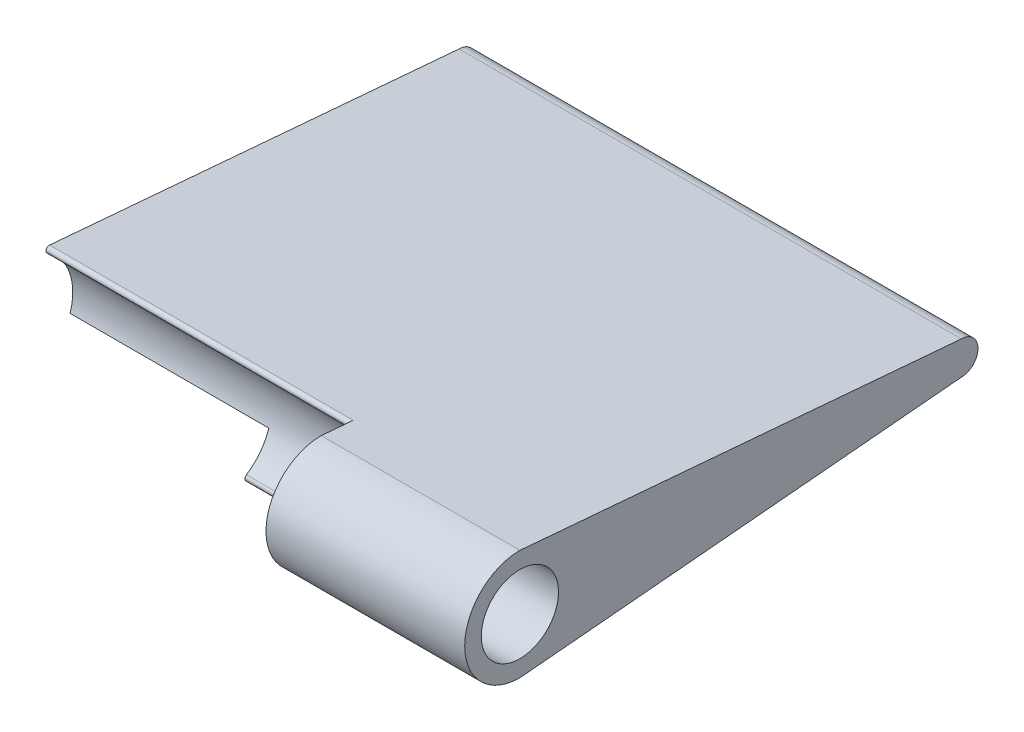
ISO-10303-21;
HEADER;
FILE_DESCRIPTION(('STEP AP214'),'2;1');
FILE_NAME('part.step','',(''),(''),'','','');
FILE_SCHEMA(('AUTOMOTIVE_DESIGN { 1 0 10303 214 1 1 1 1 }'));
ENDSEC;
DATA;
#1=APPLICATION_CONTEXT('core data for automotive mechanical design processes');
#2=APPLICATION_PROTOCOL_DEFINITION('international standard','automotive_design',2000,#1);
#3=PRODUCT_CONTEXT('',#1,'mechanical');
#4=PRODUCT('Part','Part','',(#3));
#5=PRODUCT_RELATED_PRODUCT_CATEGORY('part','',(#4));
#6=PRODUCT_DEFINITION_FORMATION('','',#4);
#7=PRODUCT_DEFINITION_CONTEXT('part definition',#1,'design');
#8=PRODUCT_DEFINITION('design','',#6,#7);
#9=PRODUCT_DEFINITION_SHAPE('','',#8);
#10=(LENGTH_UNIT() NAMED_UNIT(*) SI_UNIT(.MILLI.,.METRE.));
#11=(NAMED_UNIT(*) PLANE_ANGLE_UNIT() SI_UNIT($,.RADIAN.));
#12=(NAMED_UNIT(*) SI_UNIT($,.STERADIAN.) SOLID_ANGLE_UNIT());
#13=UNCERTAINTY_MEASURE_WITH_UNIT(LENGTH_MEASURE(1.E-05),#10,'distance_accuracy_value','');
#14=(GEOMETRIC_REPRESENTATION_CONTEXT(3) GLOBAL_UNCERTAINTY_ASSIGNED_CONTEXT((#13)) GLOBAL_UNIT_ASSIGNED_CONTEXT((#10,
#11,#12)) REPRESENTATION_CONTEXT('',''));
#15=CARTESIAN_POINT('',(0.,0.,0.));
#16=DIRECTION('',(0.,0.,1.));
#17=DIRECTION('',(1.,0.,0.));
#18=AXIS2_PLACEMENT_3D('',#15,#16,#17);
#19=CARTESIAN_POINT('',(-27.5,0.,-20.));
#20=DIRECTION('',(1.,0.,0.));
#21=DIRECTION('',(0.,0.,1.));
#22=AXIS2_PLACEMENT_3D('',#19,#20,#21);
#23=CYLINDRICAL_SURFACE('',#22,5.);
#24=CARTESIAN_POINT('',(-9.5,0.,-20.));
#25=DIRECTION('',(1.,0.,0.));
#26=DIRECTION('',(0.,0.,-1.));
#27=AXIS2_PLACEMENT_3D('',#24,#25,#26);
#28=CIRCLE('',#27,5.);
#29=CARTESIAN_POINT('',(-9.5,-1.5377558092035,-24.7576577295199));
#30=VERTEX_POINT('',#29);
#31=CARTESIAN_POINT('',(-9.5,-4.1876945933311,-22.7318883566108));
#32=VERTEX_POINT('',#31);
#33=EDGE_CURVE('E123',#30,#32,#28,.F.);
#34=ORIENTED_EDGE('',*,*,#33,.T.);
#35=DIRECTION('',(1.,0.,0.));
#36=VECTOR('',#35,1.);
#37=CARTESIAN_POINT('',(-27.5,-4.1876945933311,-22.7318883566108));
#38=LINE('',#37,#36);
#39=CARTESIAN_POINT('',(0.,-4.1876945933311,-22.7318883566108));
#40=VERTEX_POINT('',#39);
#41=EDGE_CURVE('E198',#40,#32,#38,.F.);
#42=ORIENTED_EDGE('',*,*,#41,.F.);
#43=CARTESIAN_POINT('',(0.,0.,-20.));
#44=DIRECTION('',(-1.,0.,0.));
#45=DIRECTION('',(0.,0.,1.));
#46=AXIS2_PLACEMENT_3D('',#43,#44,#45);
#47=CIRCLE('',#46,5.);
#48=CARTESIAN_POINT('',(0.,4.20184559186567,-22.7100726230341));
#49=VERTEX_POINT('',#48);
#50=EDGE_CURVE('E180',#49,#40,#47,.T.);
#51=ORIENTED_EDGE('',*,*,#50,.F.);
#52=DIRECTION('',(1.,0.,0.));
#53=VECTOR('',#52,1.);
#54=CARTESIAN_POINT('',(-27.5,4.20184559186567,-22.7100726230341));
#55=LINE('',#54,#53);
#56=CARTESIAN_POINT('',(-27.5,4.20184559186567,-22.7100726230341));
#57=VERTEX_POINT('',#56);
#58=EDGE_CURVE('E196',#57,#49,#55,.T.);
#59=ORIENTED_EDGE('',*,*,#58,.F.);
#60=CARTESIAN_POINT('',(-27.5,0.,-20.));
#61=DIRECTION('',(-1.,0.,0.));
#62=DIRECTION('',(0.,0.,1.));
#63=AXIS2_PLACEMENT_3D('',#60,#61,#62);
#64=CIRCLE('',#63,5.);
#65=CARTESIAN_POINT('',(-27.5,-1.5377558092035,-24.7576577295199));
#66=VERTEX_POINT('',#65);
#67=EDGE_CURVE('E179',#57,#66,#64,.T.);
#68=ORIENTED_EDGE('',*,*,#67,.T.);
#69=DIRECTION('',(1.,0.,0.));
#70=VECTOR('',#69,1.);
#71=CARTESIAN_POINT('',(-27.5,-1.5377558092035,-24.7576577295199));
#72=LINE('',#71,#70);
#73=EDGE_CURVE('E141',#66,#30,#72,.T.);
#74=ORIENTED_EDGE('',*,*,#73,.T.);
#75=EDGE_LOOP('',(#34,#42,#51,#59,#68,#74));
#76=FACE_BOUND('',#75,.T.);
#77=ADVANCED_FACE('F45',(#76),#23,.F.);
#78=CARTESIAN_POINT('',(-27.5,-4.9600647370598,-20.4450634667943));
#79=DIRECTION('',(0.,-0.995998467575106,-0.0893703115583744));
#80=DIRECTION('',(0.,-0.0893703115583744,0.995998467575106));
#81=AXIS2_PLACEMENT_3D('',#78,#79,#80);
#82=PLANE('',#81);
#83=DIRECTION('',(1.,0.,0.));
#84=VECTOR('',#83,1.);
#85=CARTESIAN_POINT('',(-27.5,-1.5377558092035,-58.5854077072533));
#86=LINE('',#85,#84);
#87=CARTESIAN_POINT('',(-27.5,-1.5377558092035,-58.5854077072533));
#88=VERTEX_POINT('',#87);
#89=CARTESIAN_POINT('',(-9.5,-1.5377558092035,-58.5854077072533));
#90=VERTEX_POINT('',#89);
#91=EDGE_CURVE('E134',#88,#90,#86,.T.);
#92=ORIENTED_EDGE('',*,*,#91,.F.);
#93=DIRECTION('',(0.,-0.0893703115583744,0.995998467575106));
#94=VECTOR('',#93,1.);
#95=CARTESIAN_POINT('',(-27.5,-4.9600647370598,-20.4450634667943));
#96=LINE('',#95,#94);
#97=CARTESIAN_POINT('',(-27.5,-1.41082533887994,-60.));
#98=VERTEX_POINT('',#97);
#99=EDGE_CURVE('E177',#98,#88,#96,.T.);
#100=ORIENTED_EDGE('',*,*,#99,.F.);
#101=DIRECTION('',(1.,0.,0.));
#102=VECTOR('',#101,1.);
#103=CARTESIAN_POINT('',(-27.5,-1.41082533887994,-60.));
#104=LINE('',#103,#102);
#105=CARTESIAN_POINT('',(18.,-1.41082533887995,-60.));
#106=VERTEX_POINT('',#105);
#107=EDGE_CURVE('E186',#98,#106,#104,.T.);
#108=ORIENTED_EDGE('',*,*,#107,.T.);
#109=DIRECTION('',(0.,-0.0893703115583744,0.995998467575106));
#110=VECTOR('',#109,1.);
#111=CARTESIAN_POINT('',(18.,-4.9600647370598,-20.4450634667943));
#112=LINE('',#111,#110);
#113=CARTESIAN_POINT('',(18.,-5.,-20.));
#114=VERTEX_POINT('',#113);
#115=EDGE_CURVE('E149',#106,#114,#112,.T.);
#116=ORIENTED_EDGE('',*,*,#115,.T.);
#117=DIRECTION('',(-1.,0.,0.));
#118=VECTOR('',#117,1.);
#119=CARTESIAN_POINT('',(18.,-5.,-20.));
#120=LINE('',#119,#118);
#121=CARTESIAN_POINT('',(0.,-5.,-20.));
#122=VERTEX_POINT('',#121);
#123=EDGE_CURVE('E173',#114,#122,#120,.T.);
#124=ORIENTED_EDGE('',*,*,#123,.T.);
#125=DIRECTION('',(0.,-0.0893703115583744,0.995998467575106));
#126=VECTOR('',#125,1.);
#127=CARTESIAN_POINT('',(0.,-4.9600647370598,-20.4450634667943));
#128=LINE('',#127,#126);
#129=CARTESIAN_POINT('',(0.,-4.7377558092035,-22.9226127514749));
#130=VERTEX_POINT('',#129);
#131=EDGE_CURVE('E143',#130,#122,#128,.T.);
#132=ORIENTED_EDGE('',*,*,#131,.F.);
#133=DIRECTION('',(-1.,0.,0.));
#134=VECTOR('',#133,1.);
#135=CARTESIAN_POINT('',(0.,-4.7377558092035,-22.9226127514749));
#136=LINE('',#135,#134);
#137=CARTESIAN_POINT('',(-9.5,-4.73775580920349,-22.9226127514749));
#138=VERTEX_POINT('',#137);
#139=EDGE_CURVE('E137',#138,#130,#136,.F.);
#140=ORIENTED_EDGE('',*,*,#139,.F.);
#141=DIRECTION('',(0.,-0.0893703115583744,0.995998467575106));
#142=VECTOR('',#141,1.);
#143=CARTESIAN_POINT('',(-9.5,-4.9600647370598,-20.4450634667943));
#144=LINE('',#143,#142);
#145=EDGE_CURVE('E120',#90,#138,#144,.T.);
#146=ORIENTED_EDGE('',*,*,#145,.F.);
#147=EDGE_LOOP('',(#92,#100,#108,#116,#124,#132,#140,#146));
#148=FACE_BOUND('',#147,.T.);
#149=ADVANCED_FACE('F132',(#148),#82,.T.);
#150=CARTESIAN_POINT('',(-27.5,0.,-20.));
#151=DIRECTION('',(1.,0.,0.));
#152=DIRECTION('',(0.,0.,1.));
#153=AXIS2_PLACEMENT_3D('',#150,#151,#152);
#154=PLANE('',#153);
#155=DIRECTION('',(0.,0.,1.));
#156=VECTOR('',#155,1.);
#157=CARTESIAN_POINT('',(-27.5,-1.5377558092035,-68.));
#158=LINE('',#157,#156);
#159=EDGE_CURVE('E128',#88,#66,#158,.T.);
#160=ORIENTED_EDGE('',*,*,#159,.T.);
#161=ORIENTED_EDGE('',*,*,#67,.F.);
#162=CARTESIAN_POINT('',(-27.5,4.45395632737761,-22.8726769804162));
#163=DIRECTION('',(-1.,0.,0.));
#164=DIRECTION('',(0.,0.,1.));
#165=AXIS2_PLACEMENT_3D('',#162,#163,#164);
#166=CIRCLE('',#165,0.3);
#167=CARTESIAN_POINT('',(-27.5,4.75287157714639,-22.8981656731184));
#168=VERTEX_POINT('',#167);
#169=EDGE_CURVE('E200',#168,#57,#166,.F.);
#170=ORIENTED_EDGE('',*,*,#169,.F.);
#171=DIRECTION('',(0.,0.084962309007415,0.99638416589593));
#172=VECTOR('',#171,1.);
#173=CARTESIAN_POINT('',(-27.5,4.96390703024064,-20.4232754969647));
#174=LINE('',#173,#172);
#175=CARTESIAN_POINT('',(-27.5,1.58917466112005,-60.));
#176=VERTEX_POINT('',#175);
#177=EDGE_CURVE('E183',#176,#168,#174,.T.);
#178=ORIENTED_EDGE('',*,*,#177,.F.);
#179=CARTESIAN_POINT('',(-27.5,0.0891746611200548,-60.));
#180=DIRECTION('',(-1.,0.,0.));
#181=DIRECTION('',(0.,0.,1.));
#182=AXIS2_PLACEMENT_3D('',#179,#180,#181);
#183=CIRCLE('',#182,1.5);
#184=EDGE_CURVE('E176',#176,#98,#183,.T.);
#185=ORIENTED_EDGE('',*,*,#184,.T.);
#186=ORIENTED_EDGE('',*,*,#99,.T.);
#187=EDGE_LOOP('',(#160,#161,#170,#178,#185,#186));
#188=FACE_BOUND('',#187,.T.);
#189=ADVANCED_FACE('F217',(#188),#154,.F.);
#190=CARTESIAN_POINT('',(-27.5,-4.43895626893096,-22.8958016580074));
#191=DIRECTION('',(1.,0.,0.));
#192=DIRECTION('',(0.,0.,1.));
#193=AXIS2_PLACEMENT_3D('',#190,#191,#192);
#194=CYLINDRICAL_SURFACE('',#193,0.3);
#195=ORIENTED_EDGE('',*,*,#139,.T.);
#196=CARTESIAN_POINT('',(0.,-4.43895626893096,-22.8958016580074));
#197=DIRECTION('',(-1.,0.,0.));
#198=DIRECTION('',(0.,0.,1.));
#199=AXIS2_PLACEMENT_3D('',#196,#197,#198);
#200=CIRCLE('',#199,0.3);
#201=EDGE_CURVE('E204',#130,#40,#200,.T.);
#202=ORIENTED_EDGE('',*,*,#201,.T.);
#203=ORIENTED_EDGE('',*,*,#41,.T.);
#204=CARTESIAN_POINT('',(-9.5,-4.43895626893096,-22.8958016580074));
#205=DIRECTION('',(1.,0.,0.));
#206=DIRECTION('',(0.,0.,-1.));
#207=AXIS2_PLACEMENT_3D('',#204,#205,#206);
#208=CIRCLE('',#207,0.3);
#209=EDGE_CURVE('E11',#138,#32,#208,.F.);
#210=ORIENTED_EDGE('',*,*,#209,.F.);
#211=EDGE_LOOP('',(#195,#202,#203,#210));
#212=FACE_BOUND('',#211,.T.);
#213=ADVANCED_FACE('F206',(#212),#194,.T.);
#214=CARTESIAN_POINT('',(-27.5,4.96390703024064,-20.4232754969647));
#215=DIRECTION('',(0.,-0.99638416589593,0.084962309007415));
#216=DIRECTION('',(0.,0.084962309007415,0.99638416589593));
#217=AXIS2_PLACEMENT_3D('',#214,#215,#216);
#218=PLANE('',#217);
#219=DIRECTION('',(0.,0.084962309007415,0.99638416589593));
#220=VECTOR('',#219,1.);
#221=CARTESIAN_POINT('',(0.,4.96390703024064,-20.4232754969647));
#222=LINE('',#221,#220);
#223=CARTESIAN_POINT('',(0.,4.75287157714639,-22.8981656731184));
#224=VERTEX_POINT('',#223);
#225=CARTESIAN_POINT('',(0.,5.,-20.));
#226=VERTEX_POINT('',#225);
#227=EDGE_CURVE('E166',#224,#226,#222,.T.);
#228=ORIENTED_EDGE('',*,*,#227,.T.);
#229=DIRECTION('',(-1.,0.,0.));
#230=VECTOR('',#229,1.);
#231=CARTESIAN_POINT('',(18.,5.,-20.));
#232=LINE('',#231,#230);
#233=CARTESIAN_POINT('',(18.,5.,-20.));
#234=VERTEX_POINT('',#233);
#235=EDGE_CURVE('E161',#234,#226,#232,.T.);
#236=ORIENTED_EDGE('',*,*,#235,.F.);
#237=DIRECTION('',(0.,0.084962309007415,0.99638416589593));
#238=VECTOR('',#237,1.);
#239=CARTESIAN_POINT('',(18.,4.96390703024064,-20.4232754969647));
#240=LINE('',#239,#238);
#241=CARTESIAN_POINT('',(18.,1.58917466112006,-60.));
#242=VERTEX_POINT('',#241);
#243=EDGE_CURVE('E155',#242,#234,#240,.T.);
#244=ORIENTED_EDGE('',*,*,#243,.F.);
#245=DIRECTION('',(1.,0.,0.));
#246=VECTOR('',#245,1.);
#247=CARTESIAN_POINT('',(-27.5,1.58917466112005,-60.));
#248=LINE('',#247,#246);
#249=EDGE_CURVE('E189',#176,#242,#248,.T.);
#250=ORIENTED_EDGE('',*,*,#249,.F.);
#251=ORIENTED_EDGE('',*,*,#177,.T.);
#252=DIRECTION('',(1.,0.,0.));
#253=VECTOR('',#252,1.);
#254=CARTESIAN_POINT('',(-27.5,4.75287157714639,-22.8981656731184));
#255=LINE('',#254,#253);
#256=EDGE_CURVE('E202',#224,#168,#255,.F.);
#257=ORIENTED_EDGE('',*,*,#256,.F.);
#258=EDGE_LOOP('',(#228,#236,#244,#250,#251,#257));
#259=FACE_BOUND('',#258,.T.);
#260=ADVANCED_FACE('F234',(#259),#218,.F.);
#261=CARTESIAN_POINT('',(-27.5,0.0891746611200548,-60.));
#262=DIRECTION('',(1.,0.,0.));
#263=DIRECTION('',(0.,0.,1.));
#264=AXIS2_PLACEMENT_3D('',#261,#262,#263);
#265=CYLINDRICAL_SURFACE('',#264,1.5);
#266=ORIENTED_EDGE('',*,*,#249,.T.);
#267=CARTESIAN_POINT('',(18.,0.0891746611200548,-60.));
#268=DIRECTION('',(-1.,0.,0.));
#269=DIRECTION('',(0.,0.,1.));
#270=AXIS2_PLACEMENT_3D('',#267,#268,#269);
#271=CIRCLE('',#270,1.5);
#272=EDGE_CURVE('E147',#242,#106,#271,.T.);
#273=ORIENTED_EDGE('',*,*,#272,.T.);
#274=ORIENTED_EDGE('',*,*,#107,.F.);
#275=ORIENTED_EDGE('',*,*,#184,.F.);
#276=EDGE_LOOP('',(#266,#273,#274,#275));
#277=FACE_BOUND('',#276,.T.);
#278=ADVANCED_FACE('F224',(#277),#265,.T.);
#279=CARTESIAN_POINT('',(0.,0.,-20.));
#280=DIRECTION('',(1.,0.,0.));
#281=DIRECTION('',(0.,0.,1.));
#282=AXIS2_PLACEMENT_3D('',#279,#280,#281);
#283=PLANE('',#282);
#284=CARTESIAN_POINT('',(0.,0.,-20.));
#285=DIRECTION('',(-1.,0.,0.));
#286=DIRECTION('',(0.,0.,1.));
#287=AXIS2_PLACEMENT_3D('',#284,#285,#286);
#288=CIRCLE('',#287,3.5);
#289=CARTESIAN_POINT('',(0.,0.,-16.5));
#290=VERTEX_POINT('',#289);
#291=EDGE_CURVE('E150',#290,#290,#288,.T.);
#292=ORIENTED_EDGE('',*,*,#291,.F.);
#293=EDGE_LOOP('',(#292));
#294=FACE_BOUND('',#293,.T.);
#295=ORIENTED_EDGE('',*,*,#50,.T.);
#296=ORIENTED_EDGE('',*,*,#201,.F.);
#297=ORIENTED_EDGE('',*,*,#131,.T.);
#298=CARTESIAN_POINT('',(0.,0.,-20.));
#299=DIRECTION('',(-1.,0.,0.));
#300=DIRECTION('',(0.,0.,1.));
#301=AXIS2_PLACEMENT_3D('',#298,#299,#300);
#302=CIRCLE('',#301,5.);
#303=EDGE_CURVE('E164',#122,#226,#302,.T.);
#304=ORIENTED_EDGE('',*,*,#303,.T.);
#305=ORIENTED_EDGE('',*,*,#227,.F.);
#306=CARTESIAN_POINT('',(0.,4.45395632737761,-22.8726769804162));
#307=DIRECTION('',(-1.,0.,0.));
#308=DIRECTION('',(0.,0.,1.));
#309=AXIS2_PLACEMENT_3D('',#306,#307,#308);
#310=CIRCLE('',#309,0.3);
#311=EDGE_CURVE('E53',#49,#224,#310,.T.);
#312=ORIENTED_EDGE('',*,*,#311,.F.);
#313=EDGE_LOOP('',(#295,#296,#297,#304,#305,#312));
#314=FACE_BOUND('',#313,.T.);
#315=ADVANCED_FACE('F210',(#294,#314),#283,.F.);
#316=CARTESIAN_POINT('',(18.,0.,-20.));
#317=DIRECTION('',(-1.,0.,0.));
#318=DIRECTION('',(0.,0.,-1.));
#319=AXIS2_PLACEMENT_3D('',#316,#317,#318);
#320=CYLINDRICAL_SURFACE('',#319,5.);
#321=ORIENTED_EDGE('',*,*,#303,.F.);
#322=ORIENTED_EDGE('',*,*,#123,.F.);
#323=CARTESIAN_POINT('',(18.,0.,-20.));
#324=DIRECTION('',(-1.,0.,0.));
#325=DIRECTION('',(0.,0.,1.));
#326=AXIS2_PLACEMENT_3D('',#323,#324,#325);
#327=CIRCLE('',#326,5.);
#328=EDGE_CURVE('E153',#114,#234,#327,.T.);
#329=ORIENTED_EDGE('',*,*,#328,.T.);
#330=ORIENTED_EDGE('',*,*,#235,.T.);
#331=EDGE_LOOP('',(#321,#322,#329,#330));
#332=FACE_BOUND('',#331,.T.);
#333=ADVANCED_FACE('F232',(#332),#320,.T.);
#334=CARTESIAN_POINT('',(18.,0.,-20.));
#335=DIRECTION('',(-1.,0.,0.));
#336=DIRECTION('',(0.,0.,-1.));
#337=AXIS2_PLACEMENT_3D('',#334,#335,#336);
#338=CYLINDRICAL_SURFACE('',#337,3.5);
#339=CARTESIAN_POINT('',(18.,0.,-20.));
#340=DIRECTION('',(-1.,0.,0.));
#341=DIRECTION('',(0.,0.,1.));
#342=AXIS2_PLACEMENT_3D('',#339,#340,#341);
#343=CIRCLE('',#342,3.5);
#344=CARTESIAN_POINT('',(18.,0.,-16.5));
#345=VERTEX_POINT('',#344);
#346=EDGE_CURVE('E158',#345,#345,#343,.T.);
#347=ORIENTED_EDGE('',*,*,#346,.F.);
#348=EDGE_LOOP('',(#347));
#349=FACE_BOUND('',#348,.T.);
#350=ORIENTED_EDGE('',*,*,#291,.T.);
#351=EDGE_LOOP('',(#350));
#352=FACE_BOUND('',#351,.T.);
#353=ADVANCED_FACE('F241',(#349,#352),#338,.F.);
#354=CARTESIAN_POINT('',(18.,0.,-20.));
#355=DIRECTION('',(1.,0.,0.));
#356=DIRECTION('',(0.,0.,1.));
#357=AXIS2_PLACEMENT_3D('',#354,#355,#356);
#358=PLANE('',#357);
#359=ORIENTED_EDGE('',*,*,#272,.F.);
#360=ORIENTED_EDGE('',*,*,#243,.T.);
#361=ORIENTED_EDGE('',*,*,#328,.F.);
#362=ORIENTED_EDGE('',*,*,#115,.F.);
#363=EDGE_LOOP('',(#359,#360,#361,#362));
#364=FACE_BOUND('',#363,.T.);
#365=ORIENTED_EDGE('',*,*,#346,.T.);
#366=EDGE_LOOP('',(#365));
#367=FACE_BOUND('',#366,.T.);
#368=ADVANCED_FACE('F227',(#364,#367),#358,.T.);
#369=CARTESIAN_POINT('',(-27.5,4.45395632737761,-22.8726769804162));
#370=DIRECTION('',(1.,0.,0.));
#371=DIRECTION('',(0.,0.,1.));
#372=AXIS2_PLACEMENT_3D('',#369,#370,#371);
#373=CYLINDRICAL_SURFACE('',#372,0.3);
#374=ORIENTED_EDGE('',*,*,#169,.T.);
#375=ORIENTED_EDGE('',*,*,#58,.T.);
#376=ORIENTED_EDGE('',*,*,#311,.T.);
#377=ORIENTED_EDGE('',*,*,#256,.T.);
#378=EDGE_LOOP('',(#374,#375,#376,#377));
#379=FACE_BOUND('',#378,.T.);
#380=ADVANCED_FACE('F47',(#379),#373,.T.);
#381=CARTESIAN_POINT('',(-27.5,-1.5377558092035,-68.));
#382=DIRECTION('',(0.,-1.,0.));
#383=DIRECTION('',(1.,0.,0.));
#384=AXIS2_PLACEMENT_3D('',#381,#382,#383);
#385=PLANE('',#384);
#386=ORIENTED_EDGE('',*,*,#73,.F.);
#387=ORIENTED_EDGE('',*,*,#159,.F.);
#388=ORIENTED_EDGE('',*,*,#91,.T.);
#389=DIRECTION('',(0.,0.,1.));
#390=VECTOR('',#389,1.);
#391=CARTESIAN_POINT('',(-9.5,-1.5377558092035,-68.));
#392=LINE('',#391,#390);
#393=EDGE_CURVE('E117',#90,#30,#392,.T.);
#394=ORIENTED_EDGE('',*,*,#393,.T.);
#395=EDGE_LOOP('',(#386,#387,#388,#394));
#396=FACE_BOUND('',#395,.T.);
#397=ADVANCED_FACE('F139',(#396),#385,.T.);
#398=CARTESIAN_POINT('',(-9.5,-1.5377558092035,-68.));
#399=DIRECTION('',(-1.,0.,0.));
#400=DIRECTION('',(0.,0.,-1.));
#401=AXIS2_PLACEMENT_3D('',#398,#399,#400);
#402=PLANE('',#401);
#403=ORIENTED_EDGE('',*,*,#33,.F.);
#404=ORIENTED_EDGE('',*,*,#393,.F.);
#405=ORIENTED_EDGE('',*,*,#145,.T.);
#406=ORIENTED_EDGE('',*,*,#209,.T.);
#407=EDGE_LOOP('',(#403,#404,#405,#406));
#408=FACE_BOUND('',#407,.T.);
#409=ADVANCED_FACE('F119',(#408),#402,.T.);
#410=CLOSED_SHELL('',(#77,#149,#189,#213,#260,#278,#315,#333,#353,#368,#380,#397,#409));
#411=MANIFOLD_SOLID_BREP('B2',#410);
#412=ADVANCED_BREP_SHAPE_REPRESENTATION('',(#18,#411),#14);
#413=SHAPE_DEFINITION_REPRESENTATION(#9,#412);
ENDSEC;
END-ISO-10303-21;
